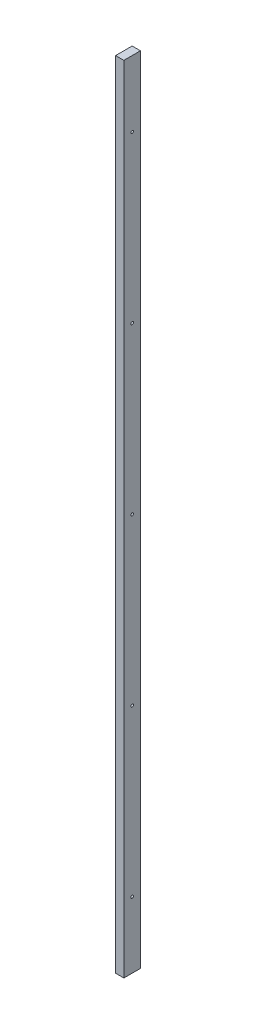
ISO-10303-21;
HEADER;
FILE_DESCRIPTION(('STEP AP214'),'2;1');
FILE_NAME('part.step','',(''),(''),'','','');
FILE_SCHEMA(('AUTOMOTIVE_DESIGN { 1 0 10303 214 1 1 1 1 }'));
ENDSEC;
DATA;
#1=APPLICATION_CONTEXT('core data for automotive mechanical design processes');
#2=APPLICATION_PROTOCOL_DEFINITION('international standard','automotive_design',2000,#1);
#3=PRODUCT_CONTEXT('',#1,'mechanical');
#4=PRODUCT('Part','Part','',(#3));
#5=PRODUCT_RELATED_PRODUCT_CATEGORY('part','',(#4));
#6=PRODUCT_DEFINITION_FORMATION('','',#4);
#7=PRODUCT_DEFINITION_CONTEXT('part definition',#1,'design');
#8=PRODUCT_DEFINITION('design','',#6,#7);
#9=PRODUCT_DEFINITION_SHAPE('','',#8);
#10=(LENGTH_UNIT() NAMED_UNIT(*) SI_UNIT(.MILLI.,.METRE.));
#11=(NAMED_UNIT(*) PLANE_ANGLE_UNIT() SI_UNIT($,.RADIAN.));
#12=(NAMED_UNIT(*) SI_UNIT($,.STERADIAN.) SOLID_ANGLE_UNIT());
#13=UNCERTAINTY_MEASURE_WITH_UNIT(LENGTH_MEASURE(1.E-05),#10,'distance_accuracy_value','');
#14=(GEOMETRIC_REPRESENTATION_CONTEXT(3) GLOBAL_UNCERTAINTY_ASSIGNED_CONTEXT((#13)) GLOBAL_UNIT_ASSIGNED_CONTEXT((#10,
#11,#12)) REPRESENTATION_CONTEXT('',''));
#15=CARTESIAN_POINT('',(0.,0.,0.));
#16=DIRECTION('',(0.,0.,1.));
#17=DIRECTION('',(1.,0.,0.));
#18=AXIS2_PLACEMENT_3D('',#15,#16,#17);
#19=CARTESIAN_POINT('',(-12.5,2400.,-25.));
#20=DIRECTION('',(1.,0.,0.));
#21=DIRECTION('',(0.,0.,-1.));
#22=AXIS2_PLACEMENT_3D('',#19,#20,#21);
#23=PLANE('',#22);
#24=CARTESIAN_POINT('',(-12.5000000000002,2200.,0.));
#25=DIRECTION('',(1.,0.,0.));
#26=DIRECTION('',(0.,0.,-1.));
#27=AXIS2_PLACEMENT_3D('',#24,#25,#26);
#28=CIRCLE('',#27,4.);
#29=CARTESIAN_POINT('',(-12.5000000000002,2200.,-4.));
#30=VERTEX_POINT('',#29);
#31=EDGE_CURVE('E114',#30,#30,#28,.T.);
#32=ORIENTED_EDGE('',*,*,#31,.T.);
#33=EDGE_LOOP('',(#32));
#34=FACE_BOUND('',#33,.T.);
#35=CARTESIAN_POINT('',(-12.5000000000002,1700.,0.));
#36=DIRECTION('',(1.,0.,0.));
#37=DIRECTION('',(0.,0.,-1.));
#38=AXIS2_PLACEMENT_3D('',#35,#36,#37);
#39=CIRCLE('',#38,4.);
#40=CARTESIAN_POINT('',(-12.5000000000002,1700.,-4.));
#41=VERTEX_POINT('',#40);
#42=EDGE_CURVE('E134',#41,#41,#39,.T.);
#43=ORIENTED_EDGE('',*,*,#42,.T.);
#44=EDGE_LOOP('',(#43));
#45=FACE_BOUND('',#44,.T.);
#46=CARTESIAN_POINT('',(-12.5000000000002,1200.,0.));
#47=DIRECTION('',(1.,0.,0.));
#48=DIRECTION('',(0.,0.,-1.));
#49=AXIS2_PLACEMENT_3D('',#46,#47,#48);
#50=CIRCLE('',#49,4.);
#51=CARTESIAN_POINT('',(-12.5000000000002,1200.,-4.));
#52=VERTEX_POINT('',#51);
#53=EDGE_CURVE('E138',#52,#52,#50,.T.);
#54=ORIENTED_EDGE('',*,*,#53,.T.);
#55=EDGE_LOOP('',(#54));
#56=FACE_BOUND('',#55,.T.);
#57=CARTESIAN_POINT('',(-12.5000000000002,700.,0.));
#58=DIRECTION('',(1.,0.,0.));
#59=DIRECTION('',(0.,0.,-1.));
#60=AXIS2_PLACEMENT_3D('',#57,#58,#59);
#61=CIRCLE('',#60,4.);
#62=CARTESIAN_POINT('',(-12.5000000000002,700.,-4.));
#63=VERTEX_POINT('',#62);
#64=EDGE_CURVE('E142',#63,#63,#61,.T.);
#65=ORIENTED_EDGE('',*,*,#64,.T.);
#66=EDGE_LOOP('',(#65));
#67=FACE_BOUND('',#66,.T.);
#68=CARTESIAN_POINT('',(-12.5000000000002,200.,0.));
#69=DIRECTION('',(1.,0.,0.));
#70=DIRECTION('',(0.,0.,-1.));
#71=AXIS2_PLACEMENT_3D('',#68,#69,#70);
#72=CIRCLE('',#71,4.);
#73=CARTESIAN_POINT('',(-12.5000000000002,200.,-4.));
#74=VERTEX_POINT('',#73);
#75=EDGE_CURVE('E146',#74,#74,#72,.T.);
#76=ORIENTED_EDGE('',*,*,#75,.T.);
#77=EDGE_LOOP('',(#76));
#78=FACE_BOUND('',#77,.T.);
#79=DIRECTION('',(0.,0.,1.));
#80=VECTOR('',#79,1.);
#81=CARTESIAN_POINT('',(-12.5,0.,-25.));
#82=LINE('',#81,#80);
#83=CARTESIAN_POINT('',(-12.5,0.,-25.));
#84=VERTEX_POINT('',#83);
#85=CARTESIAN_POINT('',(-12.5,0.,25.));
#86=VERTEX_POINT('',#85);
#87=EDGE_CURVE('E110',#84,#86,#82,.T.);
#88=ORIENTED_EDGE('',*,*,#87,.T.);
#89=DIRECTION('',(0.,-1.,0.));
#90=VECTOR('',#89,1.);
#91=CARTESIAN_POINT('',(-12.5,2400.,25.));
#92=LINE('',#91,#90);
#93=CARTESIAN_POINT('',(-12.5,2400.,25.));
#94=VERTEX_POINT('',#93);
#95=EDGE_CURVE('E11',#94,#86,#92,.T.);
#96=ORIENTED_EDGE('',*,*,#95,.F.);
#97=DIRECTION('',(0.,0.,1.));
#98=VECTOR('',#97,1.);
#99=CARTESIAN_POINT('',(-12.5,2400.,-25.));
#100=LINE('',#99,#98);
#101=CARTESIAN_POINT('',(-12.5,2400.,-25.));
#102=VERTEX_POINT('',#101);
#103=EDGE_CURVE('E94',#102,#94,#100,.T.);
#104=ORIENTED_EDGE('',*,*,#103,.F.);
#105=DIRECTION('',(0.,-1.,0.));
#106=VECTOR('',#105,1.);
#107=CARTESIAN_POINT('',(-12.5,2400.,-25.));
#108=LINE('',#107,#106);
#109=EDGE_CURVE('E106',#102,#84,#108,.T.);
#110=ORIENTED_EDGE('',*,*,#109,.T.);
#111=EDGE_LOOP('',(#88,#96,#104,#110));
#112=FACE_BOUND('',#111,.T.);
#113=ADVANCED_FACE('F42',(#34,#45,#56,#67,#78,#112),#23,.F.);
#114=CARTESIAN_POINT('',(12.5,2400.,25.));
#115=DIRECTION('',(0.,0.,-1.));
#116=DIRECTION('',(-1.,0.,0.));
#117=AXIS2_PLACEMENT_3D('',#114,#115,#116);
#118=PLANE('',#117);
#119=DIRECTION('',(1.,0.,0.));
#120=VECTOR('',#119,1.);
#121=CARTESIAN_POINT('',(12.5,0.,25.));
#122=LINE('',#121,#120);
#123=CARTESIAN_POINT('',(12.5,0.,25.));
#124=VERTEX_POINT('',#123);
#125=EDGE_CURVE('E99',#86,#124,#122,.T.);
#126=ORIENTED_EDGE('',*,*,#125,.T.);
#127=DIRECTION('',(0.,-1.,0.));
#128=VECTOR('',#127,1.);
#129=CARTESIAN_POINT('',(12.5,2400.,25.));
#130=LINE('',#129,#128);
#131=CARTESIAN_POINT('',(12.5,2400.,25.));
#132=VERTEX_POINT('',#131);
#133=EDGE_CURVE('E51',#132,#124,#130,.T.);
#134=ORIENTED_EDGE('',*,*,#133,.F.);
#135=DIRECTION('',(1.,0.,0.));
#136=VECTOR('',#135,1.);
#137=CARTESIAN_POINT('',(12.5,2400.,25.));
#138=LINE('',#137,#136);
#139=EDGE_CURVE('E89',#94,#132,#138,.T.);
#140=ORIENTED_EDGE('',*,*,#139,.F.);
#141=ORIENTED_EDGE('',*,*,#95,.T.);
#142=EDGE_LOOP('',(#126,#134,#140,#141));
#143=FACE_BOUND('',#142,.T.);
#144=ADVANCED_FACE('F98',(#143),#118,.F.);
#145=CARTESIAN_POINT('',(12.5,2400.,-25.));
#146=DIRECTION('',(-1.,0.,0.));
#147=DIRECTION('',(0.,0.,1.));
#148=AXIS2_PLACEMENT_3D('',#145,#146,#147);
#149=PLANE('',#148);
#150=CARTESIAN_POINT('',(12.5,2200.,0.));
#151=DIRECTION('',(1.,0.,0.));
#152=DIRECTION('',(0.,0.,-1.));
#153=AXIS2_PLACEMENT_3D('',#150,#151,#152);
#154=CIRCLE('',#153,4.);
#155=CARTESIAN_POINT('',(12.5,2200.,-4.));
#156=VERTEX_POINT('',#155);
#157=EDGE_CURVE('E150',#156,#156,#154,.T.);
#158=ORIENTED_EDGE('',*,*,#157,.F.);
#159=EDGE_LOOP('',(#158));
#160=FACE_BOUND('',#159,.T.);
#161=CARTESIAN_POINT('',(12.5,1700.,0.));
#162=DIRECTION('',(1.,0.,0.));
#163=DIRECTION('',(0.,0.,-1.));
#164=AXIS2_PLACEMENT_3D('',#161,#162,#163);
#165=CIRCLE('',#164,4.);
#166=CARTESIAN_POINT('',(12.5,1700.,-4.));
#167=VERTEX_POINT('',#166);
#168=EDGE_CURVE('E163',#167,#167,#165,.T.);
#169=ORIENTED_EDGE('',*,*,#168,.F.);
#170=EDGE_LOOP('',(#169));
#171=FACE_BOUND('',#170,.T.);
#172=CARTESIAN_POINT('',(12.5,1200.,0.));
#173=DIRECTION('',(1.,0.,0.));
#174=DIRECTION('',(0.,0.,-1.));
#175=AXIS2_PLACEMENT_3D('',#172,#173,#174);
#176=CIRCLE('',#175,4.);
#177=CARTESIAN_POINT('',(12.5,1200.,-4.));
#178=VERTEX_POINT('',#177);
#179=EDGE_CURVE('E159',#178,#178,#176,.T.);
#180=ORIENTED_EDGE('',*,*,#179,.F.);
#181=EDGE_LOOP('',(#180));
#182=FACE_BOUND('',#181,.T.);
#183=CARTESIAN_POINT('',(12.5,700.,0.));
#184=DIRECTION('',(1.,0.,0.));
#185=DIRECTION('',(0.,0.,-1.));
#186=AXIS2_PLACEMENT_3D('',#183,#184,#185);
#187=CIRCLE('',#186,4.);
#188=CARTESIAN_POINT('',(12.5,700.,-4.));
#189=VERTEX_POINT('',#188);
#190=EDGE_CURVE('E155',#189,#189,#187,.T.);
#191=ORIENTED_EDGE('',*,*,#190,.F.);
#192=EDGE_LOOP('',(#191));
#193=FACE_BOUND('',#192,.T.);
#194=CARTESIAN_POINT('',(12.5,200.,0.));
#195=DIRECTION('',(1.,0.,0.));
#196=DIRECTION('',(0.,0.,-1.));
#197=AXIS2_PLACEMENT_3D('',#194,#195,#196);
#198=CIRCLE('',#197,4.);
#199=CARTESIAN_POINT('',(12.5,200.,-4.));
#200=VERTEX_POINT('',#199);
#201=EDGE_CURVE('E151',#200,#200,#198,.T.);
#202=ORIENTED_EDGE('',*,*,#201,.F.);
#203=EDGE_LOOP('',(#202));
#204=FACE_BOUND('',#203,.T.);
#205=DIRECTION('',(0.,0.,-1.));
#206=VECTOR('',#205,1.);
#207=CARTESIAN_POINT('',(12.5,0.,-25.));
#208=LINE('',#207,#206);
#209=CARTESIAN_POINT('',(12.5,0.,-25.));
#210=VERTEX_POINT('',#209);
#211=EDGE_CURVE('E76',#124,#210,#208,.T.);
#212=ORIENTED_EDGE('',*,*,#211,.T.);
#213=DIRECTION('',(0.,-1.,0.));
#214=VECTOR('',#213,1.);
#215=CARTESIAN_POINT('',(12.5,2400.,-25.));
#216=LINE('',#215,#214);
#217=CARTESIAN_POINT('',(12.5,2400.,-25.));
#218=VERTEX_POINT('',#217);
#219=EDGE_CURVE('E101',#218,#210,#216,.T.);
#220=ORIENTED_EDGE('',*,*,#219,.F.);
#221=DIRECTION('',(0.,0.,-1.));
#222=VECTOR('',#221,1.);
#223=CARTESIAN_POINT('',(12.5,2400.,-25.));
#224=LINE('',#223,#222);
#225=EDGE_CURVE('E92',#132,#218,#224,.T.);
#226=ORIENTED_EDGE('',*,*,#225,.F.);
#227=ORIENTED_EDGE('',*,*,#133,.T.);
#228=EDGE_LOOP('',(#212,#220,#226,#227));
#229=FACE_BOUND('',#228,.T.);
#230=ADVANCED_FACE('F102',(#160,#171,#182,#193,#204,#229),#149,.F.);
#231=CARTESIAN_POINT('',(12.5,2400.,-25.));
#232=DIRECTION('',(0.,0.,1.));
#233=DIRECTION('',(1.,0.,0.));
#234=AXIS2_PLACEMENT_3D('',#231,#232,#233);
#235=PLANE('',#234);
#236=DIRECTION('',(-1.,0.,0.));
#237=VECTOR('',#236,1.);
#238=CARTESIAN_POINT('',(12.5,0.,-25.));
#239=LINE('',#238,#237);
#240=EDGE_CURVE('E82',#210,#84,#239,.T.);
#241=ORIENTED_EDGE('',*,*,#240,.T.);
#242=ORIENTED_EDGE('',*,*,#109,.F.);
#243=DIRECTION('',(-1.,0.,0.));
#244=VECTOR('',#243,1.);
#245=CARTESIAN_POINT('',(12.5,2400.,-25.));
#246=LINE('',#245,#244);
#247=EDGE_CURVE('E59',#218,#102,#246,.T.);
#248=ORIENTED_EDGE('',*,*,#247,.F.);
#249=ORIENTED_EDGE('',*,*,#219,.T.);
#250=EDGE_LOOP('',(#241,#242,#248,#249));
#251=FACE_BOUND('',#250,.T.);
#252=ADVANCED_FACE('F124',(#251),#235,.F.);
#253=CARTESIAN_POINT('',(0.,2400.,0.));
#254=DIRECTION('',(0.,-1.,0.));
#255=DIRECTION('',(0.,0.,-1.));
#256=AXIS2_PLACEMENT_3D('',#253,#254,#255);
#257=PLANE('',#256);
#258=ORIENTED_EDGE('',*,*,#103,.T.);
#259=ORIENTED_EDGE('',*,*,#139,.T.);
#260=ORIENTED_EDGE('',*,*,#225,.T.);
#261=ORIENTED_EDGE('',*,*,#247,.T.);
#262=EDGE_LOOP('',(#258,#259,#260,#261));
#263=FACE_BOUND('',#262,.T.);
#264=ADVANCED_FACE('F90',(#263),#257,.F.);
#265=CARTESIAN_POINT('',(0.,0.,0.));
#266=DIRECTION('',(0.,-1.,0.));
#267=DIRECTION('',(0.,0.,-1.));
#268=AXIS2_PLACEMENT_3D('',#265,#266,#267);
#269=PLANE('',#268);
#270=ORIENTED_EDGE('',*,*,#87,.F.);
#271=ORIENTED_EDGE('',*,*,#240,.F.);
#272=ORIENTED_EDGE('',*,*,#211,.F.);
#273=ORIENTED_EDGE('',*,*,#125,.F.);
#274=EDGE_LOOP('',(#270,#271,#272,#273));
#275=FACE_BOUND('',#274,.T.);
#276=ADVANCED_FACE('F127',(#275),#269,.T.);
#277=CARTESIAN_POINT('',(-2387.5,200.,0.));
#278=DIRECTION('',(1.,0.,0.));
#279=DIRECTION('',(0.,0.,-1.));
#280=AXIS2_PLACEMENT_3D('',#277,#278,#279);
#281=CYLINDRICAL_SURFACE('',#280,4.);
#282=ORIENTED_EDGE('',*,*,#201,.T.);
#283=EDGE_LOOP('',(#282));
#284=FACE_BOUND('',#283,.T.);
#285=ORIENTED_EDGE('',*,*,#75,.F.);
#286=EDGE_LOOP('',(#285));
#287=FACE_BOUND('',#286,.T.);
#288=ADVANCED_FACE('F185',(#284,#287),#281,.F.);
#289=CARTESIAN_POINT('',(-2387.5,700.,0.));
#290=DIRECTION('',(1.,0.,0.));
#291=DIRECTION('',(0.,0.,-1.));
#292=AXIS2_PLACEMENT_3D('',#289,#290,#291);
#293=CYLINDRICAL_SURFACE('',#292,4.);
#294=ORIENTED_EDGE('',*,*,#190,.T.);
#295=EDGE_LOOP('',(#294));
#296=FACE_BOUND('',#295,.T.);
#297=ORIENTED_EDGE('',*,*,#64,.F.);
#298=EDGE_LOOP('',(#297));
#299=FACE_BOUND('',#298,.T.);
#300=ADVANCED_FACE('F188',(#296,#299),#293,.F.);
#301=CARTESIAN_POINT('',(-2387.5,1200.,0.));
#302=DIRECTION('',(1.,0.,0.));
#303=DIRECTION('',(0.,0.,-1.));
#304=AXIS2_PLACEMENT_3D('',#301,#302,#303);
#305=CYLINDRICAL_SURFACE('',#304,4.);
#306=ORIENTED_EDGE('',*,*,#179,.T.);
#307=EDGE_LOOP('',(#306));
#308=FACE_BOUND('',#307,.T.);
#309=ORIENTED_EDGE('',*,*,#53,.F.);
#310=EDGE_LOOP('',(#309));
#311=FACE_BOUND('',#310,.T.);
#312=ADVANCED_FACE('F207',(#308,#311),#305,.F.);
#313=CARTESIAN_POINT('',(-2387.5,1700.,0.));
#314=DIRECTION('',(1.,0.,0.));
#315=DIRECTION('',(0.,0.,-1.));
#316=AXIS2_PLACEMENT_3D('',#313,#314,#315);
#317=CYLINDRICAL_SURFACE('',#316,4.);
#318=ORIENTED_EDGE('',*,*,#168,.T.);
#319=EDGE_LOOP('',(#318));
#320=FACE_BOUND('',#319,.T.);
#321=ORIENTED_EDGE('',*,*,#42,.F.);
#322=EDGE_LOOP('',(#321));
#323=FACE_BOUND('',#322,.T.);
#324=ADVANCED_FACE('F213',(#320,#323),#317,.F.);
#325=CARTESIAN_POINT('',(-2387.5,2200.,0.));
#326=DIRECTION('',(1.,0.,0.));
#327=DIRECTION('',(0.,0.,-1.));
#328=AXIS2_PLACEMENT_3D('',#325,#326,#327);
#329=CYLINDRICAL_SURFACE('',#328,4.);
#330=ORIENTED_EDGE('',*,*,#157,.T.);
#331=EDGE_LOOP('',(#330));
#332=FACE_BOUND('',#331,.T.);
#333=ORIENTED_EDGE('',*,*,#31,.F.);
#334=EDGE_LOOP('',(#333));
#335=FACE_BOUND('',#334,.T.);
#336=ADVANCED_FACE('F171',(#332,#335),#329,.F.);
#337=CLOSED_SHELL('',(#113,#144,#230,#252,#264,#276,#288,#300,#312,#324,#336));
#338=MANIFOLD_SOLID_BREP('B2',#337);
#339=ADVANCED_BREP_SHAPE_REPRESENTATION('',(#18,#338),#14);
#340=SHAPE_DEFINITION_REPRESENTATION(#9,#339);
ENDSEC;
END-ISO-10303-21;
